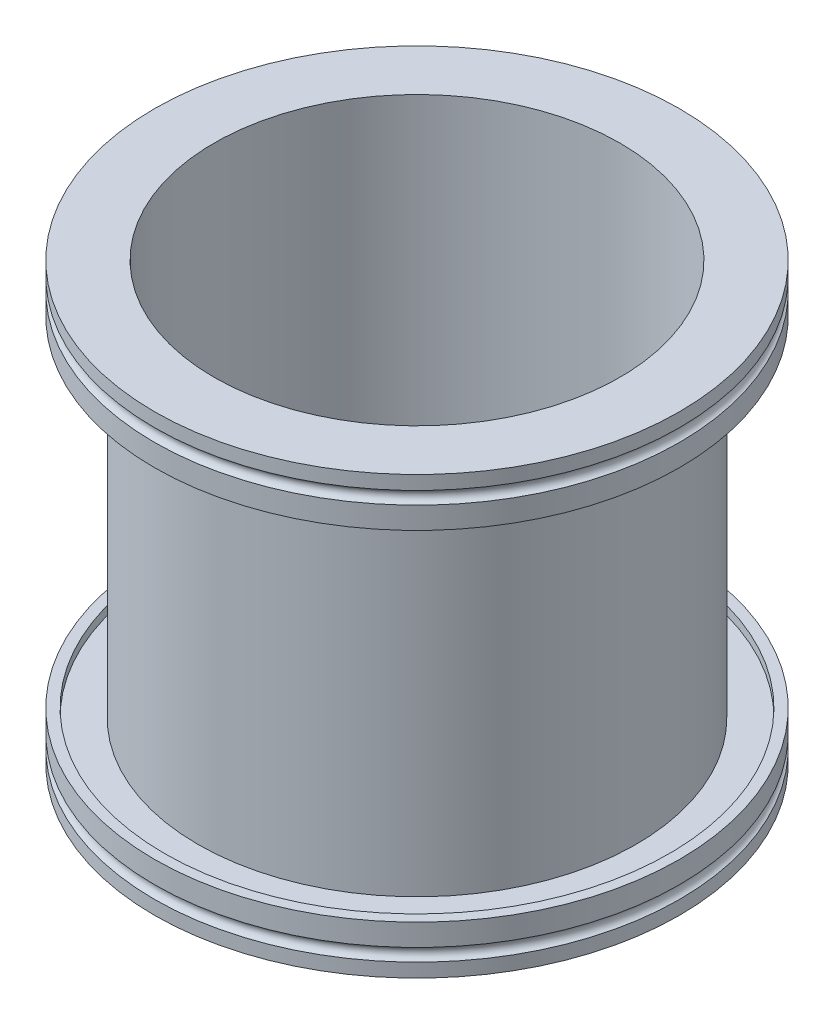
ISO-10303-21;
HEADER;
FILE_DESCRIPTION(('STEP AP214'),'2;1');
FILE_NAME('part.step','',(''),(''),'','','');
FILE_SCHEMA(('AUTOMOTIVE_DESIGN { 1 0 10303 214 1 1 1 1 }'));
ENDSEC;
DATA;
#1=APPLICATION_CONTEXT('core data for automotive mechanical design processes');
#2=APPLICATION_PROTOCOL_DEFINITION('international standard','automotive_design',2000,#1);
#3=PRODUCT_CONTEXT('',#1,'mechanical');
#4=PRODUCT('Part','Part','',(#3));
#5=PRODUCT_RELATED_PRODUCT_CATEGORY('part','',(#4));
#6=PRODUCT_DEFINITION_FORMATION('','',#4);
#7=PRODUCT_DEFINITION_CONTEXT('part definition',#1,'design');
#8=PRODUCT_DEFINITION('design','',#6,#7);
#9=PRODUCT_DEFINITION_SHAPE('','',#8);
#10=(LENGTH_UNIT() NAMED_UNIT(*) SI_UNIT(.MILLI.,.METRE.));
#11=(NAMED_UNIT(*) PLANE_ANGLE_UNIT() SI_UNIT($,.RADIAN.));
#12=(NAMED_UNIT(*) SI_UNIT($,.STERADIAN.) SOLID_ANGLE_UNIT());
#13=UNCERTAINTY_MEASURE_WITH_UNIT(LENGTH_MEASURE(1.E-05),#10,'distance_accuracy_value','');
#14=(GEOMETRIC_REPRESENTATION_CONTEXT(3) GLOBAL_UNCERTAINTY_ASSIGNED_CONTEXT((#13)) GLOBAL_UNIT_ASSIGNED_CONTEXT((#10,
#11,#12)) REPRESENTATION_CONTEXT('',''));
#15=CARTESIAN_POINT('',(0.,0.,0.));
#16=DIRECTION('',(0.,0.,1.));
#17=DIRECTION('',(1.,0.,0.));
#18=AXIS2_PLACEMENT_3D('',#15,#16,#17);
#19=CARTESIAN_POINT('',(0.,-42.,0.));
#20=DIRECTION('',(0.,-1.,0.));
#21=DIRECTION('',(0.,0.,-1.));
#22=AXIS2_PLACEMENT_3D('',#19,#20,#21);
#23=CYLINDRICAL_SURFACE('',#22,65.);
#24=CARTESIAN_POINT('',(0.,-42.,0.));
#25=DIRECTION('',(0.,1.,0.));
#26=DIRECTION('',(0.,0.,1.));
#27=AXIS2_PLACEMENT_3D('',#24,#25,#26);
#28=CIRCLE('',#27,65.);
#29=CARTESIAN_POINT('',(0.,-42.,65.));
#30=VERTEX_POINT('',#29);
#31=EDGE_CURVE('E11',#30,#30,#28,.T.);
#32=ORIENTED_EDGE('',*,*,#31,.F.);
#33=EDGE_LOOP('',(#32));
#34=FACE_BOUND('',#33,.T.);
#35=CARTESIAN_POINT('',(0.,-47.4250000000001,0.));
#36=DIRECTION('',(0.,-1.,0.));
#37=DIRECTION('',(1.,0.,0.));
#38=AXIS2_PLACEMENT_3D('',#35,#36,#37);
#39=CIRCLE('',#38,65.);
#40=CARTESIAN_POINT('',(65.,-47.425,0.));
#41=VERTEX_POINT('',#40);
#42=EDGE_CURVE('E48',#41,#41,#39,.T.);
#43=ORIENTED_EDGE('',*,*,#42,.F.);
#44=EDGE_LOOP('',(#43));
#45=FACE_BOUND('',#44,.T.);
#46=ADVANCED_FACE('F45',(#34,#45),#23,.T.);
#47=CARTESIAN_POINT('',(0.,-54.,0.));
#48=DIRECTION('',(0.,1.,0.));
#49=DIRECTION('',(0.,0.,1.));
#50=AXIS2_PLACEMENT_3D('',#47,#48,#49);
#51=CIRCLE('',#50,65.);
#52=CARTESIAN_POINT('',(0.,-54.,65.));
#53=VERTEX_POINT('',#52);
#54=EDGE_CURVE('E52',#53,#53,#51,.T.);
#55=ORIENTED_EDGE('',*,*,#54,.T.);
#56=EDGE_LOOP('',(#55));
#57=FACE_BOUND('',#56,.T.);
#58=CARTESIAN_POINT('',(0.,-50.5750000000001,0.));
#59=DIRECTION('',(0.,1.,0.));
#60=DIRECTION('',(-1.,0.,0.));
#61=AXIS2_PLACEMENT_3D('',#58,#59,#60);
#62=CIRCLE('',#61,65.);
#63=CARTESIAN_POINT('',(-65.,-50.5750000000002,0.));
#64=VERTEX_POINT('',#63);
#65=EDGE_CURVE('E61',#64,#64,#62,.T.);
#66=ORIENTED_EDGE('',*,*,#65,.F.);
#67=EDGE_LOOP('',(#66));
#68=FACE_BOUND('',#67,.T.);
#69=ADVANCED_FACE('F90',(#57,#68),#23,.T.);
#70=CARTESIAN_POINT('',(0.,-42.,0.));
#71=DIRECTION('',(0.,1.,0.));
#72=DIRECTION('',(0.,0.,1.));
#73=AXIS2_PLACEMENT_3D('',#70,#71,#72);
#74=PLANE('',#73);
#75=CARTESIAN_POINT('',(0.,-42.,0.));
#76=DIRECTION('',(0.,1.,0.));
#77=DIRECTION('',(0.,0.,1.));
#78=AXIS2_PLACEMENT_3D('',#75,#76,#77);
#79=CIRCLE('',#78,62.5);
#80=CARTESIAN_POINT('',(0.,-42.,62.5));
#81=VERTEX_POINT('',#80);
#82=EDGE_CURVE('E67',#81,#81,#79,.T.);
#83=ORIENTED_EDGE('',*,*,#82,.F.);
#84=EDGE_LOOP('',(#83));
#85=FACE_BOUND('',#84,.T.);
#86=ORIENTED_EDGE('',*,*,#31,.T.);
#87=EDGE_LOOP('',(#86));
#88=FACE_BOUND('',#87,.T.);
#89=ADVANCED_FACE('F87',(#85,#88),#74,.T.);
#90=CARTESIAN_POINT('',(0.,-54.,0.));
#91=DIRECTION('',(0.,1.,0.));
#92=DIRECTION('',(0.,0.,1.));
#93=AXIS2_PLACEMENT_3D('',#90,#91,#92);
#94=PLANE('',#93);
#95=CARTESIAN_POINT('',(0.,-54.,0.));
#96=DIRECTION('',(0.,1.,0.));
#97=DIRECTION('',(0.,0.,1.));
#98=AXIS2_PLACEMENT_3D('',#95,#96,#97);
#99=CIRCLE('',#98,50.25);
#100=CARTESIAN_POINT('',(0.,-54.,50.25));
#101=VERTEX_POINT('',#100);
#102=EDGE_CURVE('E57',#101,#101,#99,.T.);
#103=ORIENTED_EDGE('',*,*,#102,.T.);
#104=EDGE_LOOP('',(#103));
#105=FACE_BOUND('',#104,.T.);
#106=ORIENTED_EDGE('',*,*,#54,.F.);
#107=EDGE_LOOP('',(#106));
#108=FACE_BOUND('',#107,.T.);
#109=ADVANCED_FACE('F89',(#105,#108),#94,.F.);
#110=CARTESIAN_POINT('',(0.,-54.,0.));
#111=DIRECTION('',(0.,1.,0.));
#112=DIRECTION('',(0.,0.,1.));
#113=AXIS2_PLACEMENT_3D('',#110,#111,#112);
#114=CYLINDRICAL_SURFACE('',#113,50.25);
#115=ORIENTED_EDGE('',*,*,#102,.F.);
#116=EDGE_LOOP('',(#115));
#117=FACE_BOUND('',#116,.T.);
#118=CARTESIAN_POINT('',(0.,54.,0.));
#119=DIRECTION('',(0.,1.,0.));
#120=DIRECTION('',(0.,0.,1.));
#121=AXIS2_PLACEMENT_3D('',#118,#119,#120);
#122=CIRCLE('',#121,50.25);
#123=CARTESIAN_POINT('',(0.,54.,50.25));
#124=VERTEX_POINT('',#123);
#125=EDGE_CURVE('E134',#124,#124,#122,.T.);
#126=ORIENTED_EDGE('',*,*,#125,.T.);
#127=EDGE_LOOP('',(#126));
#128=FACE_BOUND('',#127,.T.);
#129=ADVANCED_FACE('F96',(#117,#128),#114,.F.);
#130=CARTESIAN_POINT('',(0.,-44.16,0.));
#131=DIRECTION('',(0.,1.,0.));
#132=DIRECTION('',(0.,0.,1.));
#133=AXIS2_PLACEMENT_3D('',#130,#131,#132);
#134=PLANE('',#133);
#135=CARTESIAN_POINT('',(0.,-44.16,0.));
#136=DIRECTION('',(0.,1.,0.));
#137=DIRECTION('',(0.,0.,1.));
#138=AXIS2_PLACEMENT_3D('',#135,#136,#137);
#139=CIRCLE('',#138,62.5);
#140=CARTESIAN_POINT('',(0.,-44.16,62.5));
#141=VERTEX_POINT('',#140);
#142=EDGE_CURVE('E80',#141,#141,#139,.T.);
#143=ORIENTED_EDGE('',*,*,#142,.T.);
#144=EDGE_LOOP('',(#143));
#145=FACE_BOUND('',#144,.T.);
#146=CARTESIAN_POINT('',(0.,-44.1599999999767,0.));
#147=DIRECTION('',(0.,1.,0.));
#148=DIRECTION('',(0.,0.,1.));
#149=AXIS2_PLACEMENT_3D('',#146,#147,#148);
#150=CIRCLE('',#149,54.25);
#151=CARTESIAN_POINT('',(0.,-44.1599999999767,54.25));
#152=VERTEX_POINT('',#151);
#153=EDGE_CURVE('E63',#152,#152,#150,.F.);
#154=ORIENTED_EDGE('',*,*,#153,.T.);
#155=EDGE_LOOP('',(#154));
#156=FACE_BOUND('',#155,.T.);
#157=ADVANCED_FACE('F120',(#145,#156),#134,.T.);
#158=CARTESIAN_POINT('',(0.,-44.16,0.));
#159=DIRECTION('',(0.,1.,0.));
#160=DIRECTION('',(0.,0.,1.));
#161=AXIS2_PLACEMENT_3D('',#158,#159,#160);
#162=CYLINDRICAL_SURFACE('',#161,62.5);
#163=ORIENTED_EDGE('',*,*,#142,.F.);
#164=EDGE_LOOP('',(#163));
#165=FACE_BOUND('',#164,.T.);
#166=ORIENTED_EDGE('',*,*,#82,.T.);
#167=EDGE_LOOP('',(#166));
#168=FACE_BOUND('',#167,.T.);
#169=ADVANCED_FACE('F85',(#165,#168),#162,.F.);
#170=CARTESIAN_POINT('',(0.,-49.0000000000001,0.));
#171=DIRECTION('',(0.,1.,0.));
#172=DIRECTION('',(-1.,0.,0.));
#173=AXIS2_PLACEMENT_3D('',#170,#171,#172);
#174=TOROIDAL_SURFACE('',#173,65.4918078893226,1.65);
#175=ORIENTED_EDGE('',*,*,#65,.T.);
#176=EDGE_LOOP('',(#175));
#177=FACE_BOUND('',#176,.T.);
#178=ORIENTED_EDGE('',*,*,#42,.T.);
#179=EDGE_LOOP('',(#178));
#180=FACE_BOUND('',#179,.T.);
#181=ADVANCED_FACE('F109',(#177,#180),#174,.F.);
#182=CARTESIAN_POINT('',(0.,500000.,0.));
#183=DIRECTION('',(0.,-1.,0.));
#184=DIRECTION('',(0.,0.,-1.));
#185=AXIS2_PLACEMENT_3D('',#182,#183,#184);
#186=CYLINDRICAL_SURFACE('',#185,54.25);
#187=CARTESIAN_POINT('',(0.,44.16,0.));
#188=DIRECTION('',(0.,1.,0.));
#189=DIRECTION('',(0.,0.,1.));
#190=AXIS2_PLACEMENT_3D('',#187,#188,#189);
#191=CIRCLE('',#190,54.25);
#192=CARTESIAN_POINT('',(0.,44.16,54.25));
#193=VERTEX_POINT('',#192);
#194=EDGE_CURVE('E136',#193,#193,#191,.F.);
#195=ORIENTED_EDGE('',*,*,#194,.T.);
#196=EDGE_LOOP('',(#195));
#197=FACE_BOUND('',#196,.T.);
#198=ORIENTED_EDGE('',*,*,#153,.F.);
#199=EDGE_LOOP('',(#198));
#200=FACE_BOUND('',#199,.T.);
#201=ADVANCED_FACE('F111',(#197,#200),#186,.T.);
#202=CARTESIAN_POINT('',(0.,42.,0.));
#203=DIRECTION('',(0.,1.,0.));
#204=DIRECTION('',(0.,0.,-1.));
#205=AXIS2_PLACEMENT_3D('',#202,#203,#204);
#206=CYLINDRICAL_SURFACE('',#205,65.);
#207=CARTESIAN_POINT('',(0.,42.,0.));
#208=DIRECTION('',(0.,1.,0.));
#209=DIRECTION('',(0.,0.,1.));
#210=AXIS2_PLACEMENT_3D('',#207,#208,#209);
#211=CIRCLE('',#210,65.);
#212=CARTESIAN_POINT('',(0.,42.,65.));
#213=VERTEX_POINT('',#212);
#214=EDGE_CURVE('E69',#213,#213,#211,.T.);
#215=ORIENTED_EDGE('',*,*,#214,.T.);
#216=EDGE_LOOP('',(#215));
#217=FACE_BOUND('',#216,.T.);
#218=CARTESIAN_POINT('',(0.,47.4250000000001,0.));
#219=DIRECTION('',(0.,-1.,0.));
#220=DIRECTION('',(1.,0.,0.));
#221=AXIS2_PLACEMENT_3D('',#218,#219,#220);
#222=CIRCLE('',#221,65.);
#223=CARTESIAN_POINT('',(65.,47.425,0.));
#224=VERTEX_POINT('',#223);
#225=EDGE_CURVE('E78',#224,#224,#222,.T.);
#226=ORIENTED_EDGE('',*,*,#225,.T.);
#227=EDGE_LOOP('',(#226));
#228=FACE_BOUND('',#227,.T.);
#229=ADVANCED_FACE('F117',(#217,#228),#206,.T.);
#230=CARTESIAN_POINT('',(0.,54.,0.));
#231=DIRECTION('',(0.,1.,0.));
#232=DIRECTION('',(0.,0.,1.));
#233=AXIS2_PLACEMENT_3D('',#230,#231,#232);
#234=CIRCLE('',#233,65.);
#235=CARTESIAN_POINT('',(0.,54.,65.));
#236=VERTEX_POINT('',#235);
#237=EDGE_CURVE('E74',#236,#236,#234,.T.);
#238=ORIENTED_EDGE('',*,*,#237,.F.);
#239=EDGE_LOOP('',(#238));
#240=FACE_BOUND('',#239,.T.);
#241=CARTESIAN_POINT('',(0.,50.5750000000001,0.));
#242=DIRECTION('',(0.,1.,0.));
#243=DIRECTION('',(-1.,0.,0.));
#244=AXIS2_PLACEMENT_3D('',#241,#242,#243);
#245=CIRCLE('',#244,65.);
#246=CARTESIAN_POINT('',(-65.,50.5750000000002,0.));
#247=VERTEX_POINT('',#246);
#248=EDGE_CURVE('E146',#247,#247,#245,.T.);
#249=ORIENTED_EDGE('',*,*,#248,.T.);
#250=EDGE_LOOP('',(#249));
#251=FACE_BOUND('',#250,.T.);
#252=ADVANCED_FACE('F180',(#240,#251),#206,.T.);
#253=CARTESIAN_POINT('',(0.,42.,0.));
#254=DIRECTION('',(0.,-1.,0.));
#255=DIRECTION('',(0.,0.,1.));
#256=AXIS2_PLACEMENT_3D('',#253,#254,#255);
#257=PLANE('',#256);
#258=CARTESIAN_POINT('',(0.,42.,0.));
#259=DIRECTION('',(0.,1.,0.));
#260=DIRECTION('',(0.,0.,1.));
#261=AXIS2_PLACEMENT_3D('',#258,#259,#260);
#262=CIRCLE('',#261,62.5);
#263=CARTESIAN_POINT('',(0.,42.,62.5));
#264=VERTEX_POINT('',#263);
#265=EDGE_CURVE('E144',#264,#264,#262,.T.);
#266=ORIENTED_EDGE('',*,*,#265,.T.);
#267=EDGE_LOOP('',(#266));
#268=FACE_BOUND('',#267,.T.);
#269=ORIENTED_EDGE('',*,*,#214,.F.);
#270=EDGE_LOOP('',(#269));
#271=FACE_BOUND('',#270,.T.);
#272=ADVANCED_FACE('F175',(#268,#271),#257,.T.);
#273=CARTESIAN_POINT('',(0.,54.,0.));
#274=DIRECTION('',(0.,-1.,0.));
#275=DIRECTION('',(0.,0.,1.));
#276=AXIS2_PLACEMENT_3D('',#273,#274,#275);
#277=PLANE('',#276);
#278=ORIENTED_EDGE('',*,*,#125,.F.);
#279=EDGE_LOOP('',(#278));
#280=FACE_BOUND('',#279,.T.);
#281=ORIENTED_EDGE('',*,*,#237,.T.);
#282=EDGE_LOOP('',(#281));
#283=FACE_BOUND('',#282,.T.);
#284=ADVANCED_FACE('F165',(#280,#283),#277,.F.);
#285=CARTESIAN_POINT('',(0.,44.16,0.));
#286=DIRECTION('',(0.,-1.,0.));
#287=DIRECTION('',(0.,0.,1.));
#288=AXIS2_PLACEMENT_3D('',#285,#286,#287);
#289=PLANE('',#288);
#290=CARTESIAN_POINT('',(0.,44.16,0.));
#291=DIRECTION('',(0.,1.,0.));
#292=DIRECTION('',(0.,0.,1.));
#293=AXIS2_PLACEMENT_3D('',#290,#291,#292);
#294=CIRCLE('',#293,62.5);
#295=CARTESIAN_POINT('',(0.,44.16,62.5));
#296=VERTEX_POINT('',#295);
#297=EDGE_CURVE('E141',#296,#296,#294,.T.);
#298=ORIENTED_EDGE('',*,*,#297,.F.);
#299=EDGE_LOOP('',(#298));
#300=FACE_BOUND('',#299,.T.);
#301=ORIENTED_EDGE('',*,*,#194,.F.);
#302=EDGE_LOOP('',(#301));
#303=FACE_BOUND('',#302,.T.);
#304=ADVANCED_FACE('F162',(#300,#303),#289,.T.);
#305=CARTESIAN_POINT('',(0.,44.16,0.));
#306=DIRECTION('',(0.,-1.,0.));
#307=DIRECTION('',(0.,0.,1.));
#308=AXIS2_PLACEMENT_3D('',#305,#306,#307);
#309=CYLINDRICAL_SURFACE('',#308,62.5);
#310=ORIENTED_EDGE('',*,*,#297,.T.);
#311=EDGE_LOOP('',(#310));
#312=FACE_BOUND('',#311,.T.);
#313=ORIENTED_EDGE('',*,*,#265,.F.);
#314=EDGE_LOOP('',(#313));
#315=FACE_BOUND('',#314,.T.);
#316=ADVANCED_FACE('F159',(#312,#315),#309,.F.);
#317=CARTESIAN_POINT('',(0.,49.0000000000001,0.));
#318=DIRECTION('',(0.,-1.,0.));
#319=DIRECTION('',(-1.,0.,0.));
#320=AXIS2_PLACEMENT_3D('',#317,#318,#319);
#321=TOROIDAL_SURFACE('',#320,65.4918078893226,1.65);
#322=ORIENTED_EDGE('',*,*,#248,.F.);
#323=EDGE_LOOP('',(#322));
#324=FACE_BOUND('',#323,.T.);
#325=ORIENTED_EDGE('',*,*,#225,.F.);
#326=EDGE_LOOP('',(#325));
#327=FACE_BOUND('',#326,.T.);
#328=ADVANCED_FACE('F173',(#324,#327),#321,.F.);
#329=CLOSED_SHELL('',(#46,#69,#89,#109,#129,#157,#169,#181,#201,#229,#252,#272,#284,#304,#316,#328));
#330=MANIFOLD_SOLID_BREP('B2',#329);
#331=ADVANCED_BREP_SHAPE_REPRESENTATION('',(#18,#330),#14);
#332=SHAPE_DEFINITION_REPRESENTATION(#9,#331);
ENDSEC;
END-ISO-10303-21;
